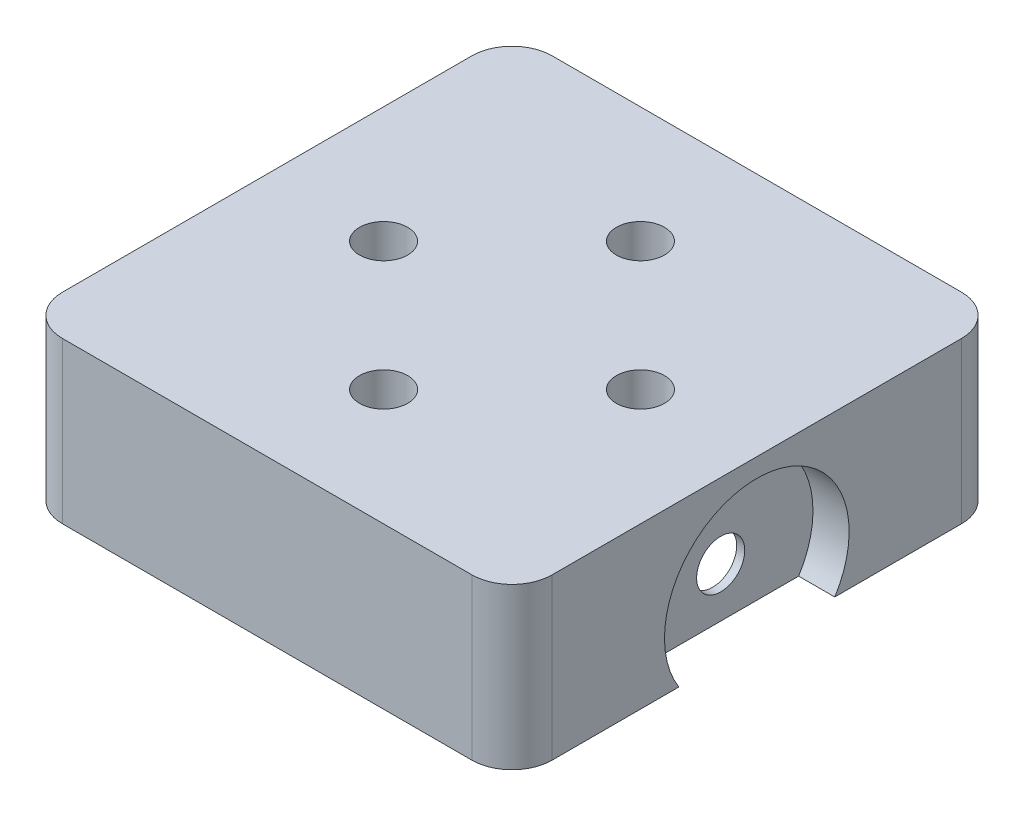
ISO-10303-21;
HEADER;
FILE_DESCRIPTION(('STEP AP214'),'2;1');
FILE_NAME('part.step','',(''),(''),'','','');
FILE_SCHEMA(('AUTOMOTIVE_DESIGN { 1 0 10303 214 1 1 1 1 }'));
ENDSEC;
DATA;
#1=APPLICATION_CONTEXT('core data for automotive mechanical design processes');
#2=APPLICATION_PROTOCOL_DEFINITION('international standard','automotive_design',2000,#1);
#3=PRODUCT_CONTEXT('',#1,'mechanical');
#4=PRODUCT('Part','Part','',(#3));
#5=PRODUCT_RELATED_PRODUCT_CATEGORY('part','',(#4));
#6=PRODUCT_DEFINITION_FORMATION('','',#4);
#7=PRODUCT_DEFINITION_CONTEXT('part definition',#1,'design');
#8=PRODUCT_DEFINITION('design','',#6,#7);
#9=PRODUCT_DEFINITION_SHAPE('','',#8);
#10=(LENGTH_UNIT() NAMED_UNIT(*) SI_UNIT(.MILLI.,.METRE.));
#11=(NAMED_UNIT(*) PLANE_ANGLE_UNIT() SI_UNIT($,.RADIAN.));
#12=(NAMED_UNIT(*) SI_UNIT($,.STERADIAN.) SOLID_ANGLE_UNIT());
#13=UNCERTAINTY_MEASURE_WITH_UNIT(LENGTH_MEASURE(1.E-05),#10,'distance_accuracy_value','');
#14=(GEOMETRIC_REPRESENTATION_CONTEXT(3) GLOBAL_UNCERTAINTY_ASSIGNED_CONTEXT((#13)) GLOBAL_UNIT_ASSIGNED_CONTEXT((#10,
#11,#12)) REPRESENTATION_CONTEXT('',''));
#15=CARTESIAN_POINT('',(0.,0.,0.));
#16=DIRECTION('',(0.,0.,1.));
#17=DIRECTION('',(1.,0.,0.));
#18=AXIS2_PLACEMENT_3D('',#15,#16,#17);
#19=CARTESIAN_POINT('',(220.,0.,-220.));
#20=DIRECTION('',(0.,-1.,0.));
#21=DIRECTION('',(0.,0.,-1.));
#22=AXIS2_PLACEMENT_3D('',#19,#20,#21);
#23=PLANE('',#22);
#24=DIRECTION('',(0.,0.,-1.));
#25=VECTOR('',#24,1.);
#26=CARTESIAN_POINT('',(250.,0.,-220.));
#27=LINE('',#26,#25);
#28=CARTESIAN_POINT('',(250.,0.,220.));
#29=VERTEX_POINT('',#28);
#30=CARTESIAN_POINT('',(250.,0.,-220.));
#31=VERTEX_POINT('',#30);
#32=EDGE_CURVE('E318',#29,#31,#27,.T.);
#33=ORIENTED_EDGE('',*,*,#32,.T.);
#34=CARTESIAN_POINT('',(220.,0.,-220.));
#35=DIRECTION('',(0.,-1.,0.));
#36=DIRECTION('',(0.,0.,-1.));
#37=AXIS2_PLACEMENT_3D('',#34,#35,#36);
#38=CIRCLE('',#37,30.);
#39=CARTESIAN_POINT('',(220.,0.,-250.));
#40=VERTEX_POINT('',#39);
#41=EDGE_CURVE('E391',#31,#40,#38,.F.);
#42=ORIENTED_EDGE('',*,*,#41,.T.);
#43=DIRECTION('',(-1.,0.,0.));
#44=VECTOR('',#43,1.);
#45=CARTESIAN_POINT('',(220.,0.,-250.));
#46=LINE('',#45,#44);
#47=CARTESIAN_POINT('',(-220.,0.,-250.));
#48=VERTEX_POINT('',#47);
#49=EDGE_CURVE('E395',#40,#48,#46,.T.);
#50=ORIENTED_EDGE('',*,*,#49,.T.);
#51=CARTESIAN_POINT('',(-220.,0.,-220.));
#52=DIRECTION('',(0.,-1.,0.));
#53=DIRECTION('',(0.,0.,-1.));
#54=AXIS2_PLACEMENT_3D('',#51,#52,#53);
#55=CIRCLE('',#54,30.);
#56=CARTESIAN_POINT('',(-250.,0.,-220.));
#57=VERTEX_POINT('',#56);
#58=EDGE_CURVE('E415',#48,#57,#55,.F.);
#59=ORIENTED_EDGE('',*,*,#58,.T.);
#60=DIRECTION('',(0.,0.,1.));
#61=VECTOR('',#60,1.);
#62=CARTESIAN_POINT('',(-250.,0.,-220.));
#63=LINE('',#62,#61);
#64=CARTESIAN_POINT('',(-250.,0.,220.));
#65=VERTEX_POINT('',#64);
#66=EDGE_CURVE('E411',#57,#65,#63,.T.);
#67=ORIENTED_EDGE('',*,*,#66,.T.);
#68=CARTESIAN_POINT('',(-220.,0.,220.));
#69=DIRECTION('',(0.,-1.,0.));
#70=DIRECTION('',(0.,0.,-1.));
#71=AXIS2_PLACEMENT_3D('',#68,#69,#70);
#72=CIRCLE('',#71,30.);
#73=CARTESIAN_POINT('',(-220.,0.,250.));
#74=VERTEX_POINT('',#73);
#75=EDGE_CURVE('E407',#65,#74,#72,.F.);
#76=ORIENTED_EDGE('',*,*,#75,.T.);
#77=DIRECTION('',(1.,0.,0.));
#78=VECTOR('',#77,1.);
#79=CARTESIAN_POINT('',(220.,0.,250.));
#80=LINE('',#79,#78);
#81=CARTESIAN_POINT('',(220.,0.,250.));
#82=VERTEX_POINT('',#81);
#83=EDGE_CURVE('E403',#74,#82,#80,.T.);
#84=ORIENTED_EDGE('',*,*,#83,.T.);
#85=CARTESIAN_POINT('',(220.,0.,220.));
#86=DIRECTION('',(0.,-1.,0.));
#87=DIRECTION('',(0.,0.,-1.));
#88=AXIS2_PLACEMENT_3D('',#85,#86,#87);
#89=CIRCLE('',#88,30.);
#90=EDGE_CURVE('E399',#82,#29,#89,.F.);
#91=ORIENTED_EDGE('',*,*,#90,.T.);
#92=EDGE_LOOP('',(#33,#42,#50,#59,#67,#76,#84,#91));
#93=FACE_BOUND('',#92,.T.);
#94=DIRECTION('',(0.,0.,1.));
#95=VECTOR('',#94,1.);
#96=CARTESIAN_POINT('',(-305.,0.,-255.));
#97=LINE('',#96,#95);
#98=CARTESIAN_POINT('',(-305.,0.,97.130306202736));
#99=VERTEX_POINT('',#98);
#100=CARTESIAN_POINT('',(-305.,0.,255.));
#101=VERTEX_POINT('',#100);
#102=EDGE_CURVE('E194',#99,#101,#97,.T.);
#103=ORIENTED_EDGE('',*,*,#102,.F.);
#104=DIRECTION('',(-1.,0.,0.));
#105=VECTOR('',#104,1.);
#106=CARTESIAN_POINT('',(-260.,0.,97.130306202736));
#107=LINE('',#106,#105);
#108=CARTESIAN_POINT('',(-260.,0.,97.130306202736));
#109=VERTEX_POINT('',#108);
#110=EDGE_CURVE('E55',#99,#109,#107,.F.);
#111=ORIENTED_EDGE('',*,*,#110,.T.);
#112=DIRECTION('',(0.,0.,-1.));
#113=VECTOR('',#112,1.);
#114=CARTESIAN_POINT('',(-260.,0.,-220.));
#115=LINE('',#114,#113);
#116=CARTESIAN_POINT('',(-260.,0.,-97.130306202736));
#117=VERTEX_POINT('',#116);
#118=EDGE_CURVE('E179',#109,#117,#115,.T.);
#119=ORIENTED_EDGE('',*,*,#118,.T.);
#120=DIRECTION('',(-1.,0.,0.));
#121=VECTOR('',#120,1.);
#122=CARTESIAN_POINT('',(-260.,0.,-97.130306202736));
#123=LINE('',#122,#121);
#124=CARTESIAN_POINT('',(-305.,0.,-97.130306202736));
#125=VERTEX_POINT('',#124);
#126=EDGE_CURVE('E186',#117,#125,#123,.T.);
#127=ORIENTED_EDGE('',*,*,#126,.T.);
#128=CARTESIAN_POINT('',(-305.,0.,-255.));
#129=VERTEX_POINT('',#128);
#130=EDGE_CURVE('E258',#129,#125,#97,.T.);
#131=ORIENTED_EDGE('',*,*,#130,.F.);
#132=CARTESIAN_POINT('',(-255.,0.,-255.));
#133=DIRECTION('',(0.,1.,0.));
#134=DIRECTION('',(0.,0.,-1.));
#135=AXIS2_PLACEMENT_3D('',#132,#133,#134);
#136=CIRCLE('',#135,50.);
#137=CARTESIAN_POINT('',(-255.,0.,-305.));
#138=VERTEX_POINT('',#137);
#139=EDGE_CURVE('E255',#138,#129,#136,.T.);
#140=ORIENTED_EDGE('',*,*,#139,.F.);
#141=DIRECTION('',(-1.,0.,0.));
#142=VECTOR('',#141,1.);
#143=CARTESIAN_POINT('',(-255.,0.,-305.));
#144=LINE('',#143,#142);
#145=CARTESIAN_POINT('',(255.,0.,-305.));
#146=VERTEX_POINT('',#145);
#147=EDGE_CURVE('E252',#146,#138,#144,.T.);
#148=ORIENTED_EDGE('',*,*,#147,.F.);
#149=CARTESIAN_POINT('',(255.,0.,-255.));
#150=DIRECTION('',(0.,1.,0.));
#151=DIRECTION('',(0.,0.,-1.));
#152=AXIS2_PLACEMENT_3D('',#149,#150,#151);
#153=CIRCLE('',#152,50.);
#154=CARTESIAN_POINT('',(305.,0.,-255.));
#155=VERTEX_POINT('',#154);
#156=EDGE_CURVE('E221',#155,#146,#153,.T.);
#157=ORIENTED_EDGE('',*,*,#156,.F.);
#158=DIRECTION('',(0.,0.,-1.));
#159=VECTOR('',#158,1.);
#160=CARTESIAN_POINT('',(305.,0.,-255.));
#161=LINE('',#160,#159);
#162=CARTESIAN_POINT('',(305.,0.,-97.130306202736));
#163=VERTEX_POINT('',#162);
#164=EDGE_CURVE('E271',#163,#155,#161,.T.);
#165=ORIENTED_EDGE('',*,*,#164,.F.);
#166=DIRECTION('',(1.,0.,0.));
#167=VECTOR('',#166,1.);
#168=CARTESIAN_POINT('',(260.,0.,-97.130306202736));
#169=LINE('',#168,#167);
#170=CARTESIAN_POINT('',(260.,0.,-97.130306202736));
#171=VERTEX_POINT('',#170);
#172=EDGE_CURVE('E63',#171,#163,#169,.T.);
#173=ORIENTED_EDGE('',*,*,#172,.F.);
#174=DIRECTION('',(0.,0.,1.));
#175=VECTOR('',#174,1.);
#176=CARTESIAN_POINT('',(260.,0.,-220.));
#177=LINE('',#176,#175);
#178=CARTESIAN_POINT('',(260.,0.,97.130306202736));
#179=VERTEX_POINT('',#178);
#180=EDGE_CURVE('E49',#171,#179,#177,.T.);
#181=ORIENTED_EDGE('',*,*,#180,.T.);
#182=DIRECTION('',(1.,0.,0.));
#183=VECTOR('',#182,1.);
#184=CARTESIAN_POINT('',(260.,0.,97.130306202736));
#185=LINE('',#184,#183);
#186=CARTESIAN_POINT('',(305.,0.,97.130306202736));
#187=VERTEX_POINT('',#186);
#188=EDGE_CURVE('E216',#187,#179,#185,.F.);
#189=ORIENTED_EDGE('',*,*,#188,.F.);
#190=CARTESIAN_POINT('',(305.,0.,255.));
#191=VERTEX_POINT('',#190);
#192=EDGE_CURVE('E227',#191,#187,#161,.T.);
#193=ORIENTED_EDGE('',*,*,#192,.F.);
#194=CARTESIAN_POINT('',(255.,0.,255.));
#195=DIRECTION('',(0.,1.,0.));
#196=DIRECTION('',(0.,0.,1.));
#197=AXIS2_PLACEMENT_3D('',#194,#195,#196);
#198=CIRCLE('',#197,50.);
#199=CARTESIAN_POINT('',(255.,0.,305.));
#200=VERTEX_POINT('',#199);
#201=EDGE_CURVE('E268',#200,#191,#198,.T.);
#202=ORIENTED_EDGE('',*,*,#201,.F.);
#203=DIRECTION('',(1.,0.,0.));
#204=VECTOR('',#203,1.);
#205=CARTESIAN_POINT('',(-255.,0.,305.));
#206=LINE('',#205,#204);
#207=CARTESIAN_POINT('',(-255.,0.,305.));
#208=VERTEX_POINT('',#207);
#209=EDGE_CURVE('E265',#208,#200,#206,.T.);
#210=ORIENTED_EDGE('',*,*,#209,.F.);
#211=CARTESIAN_POINT('',(-255.,0.,255.));
#212=DIRECTION('',(0.,1.,0.));
#213=DIRECTION('',(0.,0.,-1.));
#214=AXIS2_PLACEMENT_3D('',#211,#212,#213);
#215=CIRCLE('',#214,50.);
#216=EDGE_CURVE('E262',#101,#208,#215,.T.);
#217=ORIENTED_EDGE('',*,*,#216,.F.);
#218=EDGE_LOOP('',(#103,#111,#119,#127,#131,#140,#148,#157,#165,#173,#181,#189,#193,#202,#210,#217));
#219=FACE_BOUND('',#218,.T.);
#220=ADVANCED_FACE('F41',(#93,#219),#23,.T.);
#221=CARTESIAN_POINT('',(-305.,61.5686902326398,0.));
#222=DIRECTION('',(1.,0.,0.));
#223=DIRECTION('',(0.,0.,-1.));
#224=AXIS2_PLACEMENT_3D('',#221,#222,#223);
#225=CYLINDRICAL_SURFACE('',#224,30.);
#226=CARTESIAN_POINT('',(-250.,61.5686902326398,0.));
#227=DIRECTION('',(1.,0.,0.));
#228=DIRECTION('',(0.,0.,-1.));
#229=AXIS2_PLACEMENT_3D('',#226,#227,#228);
#230=CIRCLE('',#229,30.);
#231=CARTESIAN_POINT('',(-250.,61.5686902326398,-30.));
#232=VERTEX_POINT('',#231);
#233=EDGE_CURVE('E208',#232,#232,#230,.T.);
#234=ORIENTED_EDGE('',*,*,#233,.T.);
#235=EDGE_LOOP('',(#234));
#236=FACE_BOUND('',#235,.T.);
#237=CARTESIAN_POINT('',(-260.,61.5686902326398,0.));
#238=DIRECTION('',(-1.,0.,0.));
#239=DIRECTION('',(0.,0.,1.));
#240=AXIS2_PLACEMENT_3D('',#237,#238,#239);
#241=CIRCLE('',#240,30.);
#242=CARTESIAN_POINT('',(-260.,61.5686902326398,30.));
#243=VERTEX_POINT('',#242);
#244=EDGE_CURVE('E187',#243,#243,#241,.F.);
#245=ORIENTED_EDGE('',*,*,#244,.F.);
#246=EDGE_LOOP('',(#245));
#247=FACE_BOUND('',#246,.T.);
#248=ADVANCED_FACE('F462',(#236,#247),#225,.F.);
#249=CARTESIAN_POINT('',(220.,200.,-220.));
#250=DIRECTION('',(0.,-1.,0.));
#251=DIRECTION('',(0.,0.,-1.));
#252=AXIS2_PLACEMENT_3D('',#249,#250,#251);
#253=CYLINDRICAL_SURFACE('',#252,30.);
#254=ORIENTED_EDGE('',*,*,#41,.F.);
#255=DIRECTION('',(0.,-1.,0.));
#256=VECTOR('',#255,1.);
#257=CARTESIAN_POINT('',(250.,200.,-220.));
#258=LINE('',#257,#256);
#259=CARTESIAN_POINT('',(250.,180.,-220.));
#260=VERTEX_POINT('',#259);
#261=EDGE_CURVE('E319',#260,#31,#258,.T.);
#262=ORIENTED_EDGE('',*,*,#261,.F.);
#263=CARTESIAN_POINT('',(220.,180.,-220.));
#264=DIRECTION('',(0.,-1.,0.));
#265=DIRECTION('',(0.,0.,-1.));
#266=AXIS2_PLACEMENT_3D('',#263,#264,#265);
#267=CIRCLE('',#266,30.);
#268=CARTESIAN_POINT('',(220.,180.,-250.));
#269=VERTEX_POINT('',#268);
#270=EDGE_CURVE('E313',#260,#269,#267,.F.);
#271=ORIENTED_EDGE('',*,*,#270,.T.);
#272=DIRECTION('',(0.,1.,0.));
#273=VECTOR('',#272,1.);
#274=CARTESIAN_POINT('',(220.,200.,-250.));
#275=LINE('',#274,#273);
#276=EDGE_CURVE('E307',#269,#40,#275,.F.);
#277=ORIENTED_EDGE('',*,*,#276,.T.);
#278=EDGE_LOOP('',(#254,#262,#271,#277));
#279=FACE_BOUND('',#278,.T.);
#280=ADVANCED_FACE('F464',(#279),#253,.F.);
#281=CARTESIAN_POINT('',(-220.,200.,-250.));
#282=DIRECTION('',(0.,0.,1.));
#283=DIRECTION('',(1.,0.,0.));
#284=AXIS2_PLACEMENT_3D('',#281,#282,#283);
#285=PLANE('',#284);
#286=ORIENTED_EDGE('',*,*,#49,.F.);
#287=ORIENTED_EDGE('',*,*,#276,.F.);
#288=DIRECTION('',(-1.,0.,0.));
#289=VECTOR('',#288,1.);
#290=CARTESIAN_POINT('',(220.,180.,-250.));
#291=LINE('',#290,#289);
#292=CARTESIAN_POINT('',(-220.,180.,-250.));
#293=VERTEX_POINT('',#292);
#294=EDGE_CURVE('E317',#269,#293,#291,.T.);
#295=ORIENTED_EDGE('',*,*,#294,.T.);
#296=DIRECTION('',(0.,-1.,0.));
#297=VECTOR('',#296,1.);
#298=CARTESIAN_POINT('',(-220.,200.,-250.));
#299=LINE('',#298,#297);
#300=EDGE_CURVE('E312',#293,#48,#299,.T.);
#301=ORIENTED_EDGE('',*,*,#300,.T.);
#302=EDGE_LOOP('',(#286,#287,#295,#301));
#303=FACE_BOUND('',#302,.T.);
#304=ADVANCED_FACE('F472',(#303),#285,.T.);
#305=CARTESIAN_POINT('',(-220.,200.,-220.));
#306=DIRECTION('',(0.,-1.,0.));
#307=DIRECTION('',(0.,0.,-1.));
#308=AXIS2_PLACEMENT_3D('',#305,#306,#307);
#309=CYLINDRICAL_SURFACE('',#308,30.);
#310=ORIENTED_EDGE('',*,*,#58,.F.);
#311=ORIENTED_EDGE('',*,*,#300,.F.);
#312=CARTESIAN_POINT('',(-220.,180.,-220.));
#313=DIRECTION('',(0.,-1.,0.));
#314=DIRECTION('',(0.,0.,-1.));
#315=AXIS2_PLACEMENT_3D('',#312,#313,#314);
#316=CIRCLE('',#315,30.);
#317=CARTESIAN_POINT('',(-250.,180.,-220.));
#318=VERTEX_POINT('',#317);
#319=EDGE_CURVE('E330',#293,#318,#316,.F.);
#320=ORIENTED_EDGE('',*,*,#319,.T.);
#321=DIRECTION('',(0.,1.,0.));
#322=VECTOR('',#321,1.);
#323=CARTESIAN_POINT('',(-250.,200.,-220.));
#324=LINE('',#323,#322);
#325=EDGE_CURVE('E327',#318,#57,#324,.F.);
#326=ORIENTED_EDGE('',*,*,#325,.T.);
#327=EDGE_LOOP('',(#310,#311,#320,#326));
#328=FACE_BOUND('',#327,.T.);
#329=ADVANCED_FACE('F563',(#328),#309,.F.);
#330=CARTESIAN_POINT('',(-250.,200.,-220.));
#331=DIRECTION('',(1.,0.,0.));
#332=DIRECTION('',(0.,0.,-1.));
#333=AXIS2_PLACEMENT_3D('',#330,#331,#332);
#334=PLANE('',#333);
#335=ORIENTED_EDGE('',*,*,#233,.F.);
#336=EDGE_LOOP('',(#335));
#337=FACE_BOUND('',#336,.T.);
#338=ORIENTED_EDGE('',*,*,#66,.F.);
#339=ORIENTED_EDGE('',*,*,#325,.F.);
#340=DIRECTION('',(0.,0.,1.));
#341=VECTOR('',#340,1.);
#342=CARTESIAN_POINT('',(-250.,180.,-220.));
#343=LINE('',#342,#341);
#344=CARTESIAN_POINT('',(-250.,180.,220.));
#345=VERTEX_POINT('',#344);
#346=EDGE_CURVE('E336',#318,#345,#343,.T.);
#347=ORIENTED_EDGE('',*,*,#346,.T.);
#348=DIRECTION('',(0.,-1.,0.));
#349=VECTOR('',#348,1.);
#350=CARTESIAN_POINT('',(-250.,200.,220.));
#351=LINE('',#350,#349);
#352=EDGE_CURVE('E333',#345,#65,#351,.T.);
#353=ORIENTED_EDGE('',*,*,#352,.T.);
#354=EDGE_LOOP('',(#338,#339,#347,#353));
#355=FACE_BOUND('',#354,.T.);
#356=ADVANCED_FACE('F567',(#337,#355),#334,.T.);
#357=CARTESIAN_POINT('',(-220.,200.,220.));
#358=DIRECTION('',(0.,-1.,0.));
#359=DIRECTION('',(0.,0.,-1.));
#360=AXIS2_PLACEMENT_3D('',#357,#358,#359);
#361=CYLINDRICAL_SURFACE('',#360,30.);
#362=ORIENTED_EDGE('',*,*,#75,.F.);
#363=ORIENTED_EDGE('',*,*,#352,.F.);
#364=CARTESIAN_POINT('',(-220.,180.,220.));
#365=DIRECTION('',(0.,-1.,0.));
#366=DIRECTION('',(0.,0.,-1.));
#367=AXIS2_PLACEMENT_3D('',#364,#365,#366);
#368=CIRCLE('',#367,30.);
#369=CARTESIAN_POINT('',(-220.,180.,250.));
#370=VERTEX_POINT('',#369);
#371=EDGE_CURVE('E342',#345,#370,#368,.F.);
#372=ORIENTED_EDGE('',*,*,#371,.T.);
#373=DIRECTION('',(0.,1.,0.));
#374=VECTOR('',#373,1.);
#375=CARTESIAN_POINT('',(-220.,200.,250.));
#376=LINE('',#375,#374);
#377=EDGE_CURVE('E339',#370,#74,#376,.F.);
#378=ORIENTED_EDGE('',*,*,#377,.T.);
#379=EDGE_LOOP('',(#362,#363,#372,#378));
#380=FACE_BOUND('',#379,.T.);
#381=ADVANCED_FACE('F571',(#380),#361,.F.);
#382=CARTESIAN_POINT('',(-220.,200.,250.));
#383=DIRECTION('',(0.,0.,-1.));
#384=DIRECTION('',(-1.,0.,0.));
#385=AXIS2_PLACEMENT_3D('',#382,#383,#384);
#386=PLANE('',#385);
#387=ORIENTED_EDGE('',*,*,#83,.F.);
#388=ORIENTED_EDGE('',*,*,#377,.F.);
#389=DIRECTION('',(1.,0.,0.));
#390=VECTOR('',#389,1.);
#391=CARTESIAN_POINT('',(220.,180.,250.));
#392=LINE('',#391,#390);
#393=CARTESIAN_POINT('',(220.,180.,250.));
#394=VERTEX_POINT('',#393);
#395=EDGE_CURVE('E348',#370,#394,#392,.T.);
#396=ORIENTED_EDGE('',*,*,#395,.T.);
#397=DIRECTION('',(0.,-1.,0.));
#398=VECTOR('',#397,1.);
#399=CARTESIAN_POINT('',(220.,200.,250.));
#400=LINE('',#399,#398);
#401=EDGE_CURVE('E345',#394,#82,#400,.T.);
#402=ORIENTED_EDGE('',*,*,#401,.T.);
#403=EDGE_LOOP('',(#387,#388,#396,#402));
#404=FACE_BOUND('',#403,.T.);
#405=ADVANCED_FACE('F575',(#404),#386,.T.);
#406=CARTESIAN_POINT('',(220.,200.,220.));
#407=DIRECTION('',(0.,-1.,0.));
#408=DIRECTION('',(0.,0.,-1.));
#409=AXIS2_PLACEMENT_3D('',#406,#407,#408);
#410=CYLINDRICAL_SURFACE('',#409,30.);
#411=ORIENTED_EDGE('',*,*,#90,.F.);
#412=ORIENTED_EDGE('',*,*,#401,.F.);
#413=CARTESIAN_POINT('',(220.,180.,220.));
#414=DIRECTION('',(0.,-1.,0.));
#415=DIRECTION('',(0.,0.,-1.));
#416=AXIS2_PLACEMENT_3D('',#413,#414,#415);
#417=CIRCLE('',#416,30.);
#418=CARTESIAN_POINT('',(250.,180.,220.));
#419=VERTEX_POINT('',#418);
#420=EDGE_CURVE('E353',#394,#419,#417,.F.);
#421=ORIENTED_EDGE('',*,*,#420,.T.);
#422=DIRECTION('',(0.,1.,0.));
#423=VECTOR('',#422,1.);
#424=CARTESIAN_POINT('',(250.,200.,220.));
#425=LINE('',#424,#423);
#426=EDGE_CURVE('E322',#419,#29,#425,.F.);
#427=ORIENTED_EDGE('',*,*,#426,.T.);
#428=EDGE_LOOP('',(#411,#412,#421,#427));
#429=FACE_BOUND('',#428,.T.);
#430=ADVANCED_FACE('F579',(#429),#410,.F.);
#431=CARTESIAN_POINT('',(250.,200.,-220.));
#432=DIRECTION('',(-1.,0.,0.));
#433=DIRECTION('',(0.,0.,1.));
#434=AXIS2_PLACEMENT_3D('',#431,#432,#433);
#435=PLANE('',#434);
#436=CARTESIAN_POINT('',(250.,61.5686902326398,0.));
#437=DIRECTION('',(-1.,0.,0.));
#438=DIRECTION('',(0.,0.,1.));
#439=AXIS2_PLACEMENT_3D('',#436,#437,#438);
#440=CIRCLE('',#439,30.);
#441=CARTESIAN_POINT('',(250.,61.5686902326398,30.));
#442=VERTEX_POINT('',#441);
#443=EDGE_CURVE('E201',#442,#442,#440,.T.);
#444=ORIENTED_EDGE('',*,*,#443,.F.);
#445=EDGE_LOOP('',(#444));
#446=FACE_BOUND('',#445,.T.);
#447=ORIENTED_EDGE('',*,*,#32,.F.);
#448=ORIENTED_EDGE('',*,*,#426,.F.);
#449=DIRECTION('',(0.,0.,-1.));
#450=VECTOR('',#449,1.);
#451=CARTESIAN_POINT('',(250.,180.,-220.));
#452=LINE('',#451,#450);
#453=EDGE_CURVE('E323',#419,#260,#452,.T.);
#454=ORIENTED_EDGE('',*,*,#453,.T.);
#455=ORIENTED_EDGE('',*,*,#261,.T.);
#456=EDGE_LOOP('',(#447,#448,#454,#455));
#457=FACE_BOUND('',#456,.T.);
#458=ADVANCED_FACE('F583',(#446,#457),#435,.T.);
#459=CARTESIAN_POINT('',(220.,180.,-220.));
#460=DIRECTION('',(0.,-1.,0.));
#461=DIRECTION('',(0.,0.,-1.));
#462=AXIS2_PLACEMENT_3D('',#459,#460,#461);
#463=PLANE('',#462);
#464=CARTESIAN_POINT('',(0.,180.,-160.));
#465=DIRECTION('',(0.,-1.,0.));
#466=DIRECTION('',(0.,0.,-1.));
#467=AXIS2_PLACEMENT_3D('',#464,#465,#466);
#468=CIRCLE('',#467,50.);
#469=CARTESIAN_POINT('',(0.,180.,-210.));
#470=VERTEX_POINT('',#469);
#471=EDGE_CURVE('E360',#470,#470,#468,.F.);
#472=ORIENTED_EDGE('',*,*,#471,.T.);
#473=EDGE_LOOP('',(#472));
#474=FACE_BOUND('',#473,.T.);
#475=CARTESIAN_POINT('',(160.000000000003,180.,-2.79725621607198E-12));
#476=DIRECTION('',(0.,-1.,0.));
#477=DIRECTION('',(0.,0.,-1.));
#478=AXIS2_PLACEMENT_3D('',#475,#476,#477);
#479=CIRCLE('',#478,50.);
#480=CARTESIAN_POINT('',(160.000000000003,180.,-50.0000000000028));
#481=VERTEX_POINT('',#480);
#482=EDGE_CURVE('E366',#481,#481,#479,.F.);
#483=ORIENTED_EDGE('',*,*,#482,.T.);
#484=EDGE_LOOP('',(#483));
#485=FACE_BOUND('',#484,.T.);
#486=CARTESIAN_POINT('',(5.59451243214397E-12,180.,160.));
#487=DIRECTION('',(0.,-1.,0.));
#488=DIRECTION('',(0.,0.,-1.));
#489=AXIS2_PLACEMENT_3D('',#486,#487,#488);
#490=CIRCLE('',#489,50.);
#491=CARTESIAN_POINT('',(5.59451243214397E-12,180.,110.));
#492=VERTEX_POINT('',#491);
#493=EDGE_CURVE('E371',#492,#492,#490,.F.);
#494=ORIENTED_EDGE('',*,*,#493,.T.);
#495=EDGE_LOOP('',(#494));
#496=FACE_BOUND('',#495,.T.);
#497=CARTESIAN_POINT('',(-159.999999999997,180.,2.81685056485834E-12));
#498=DIRECTION('',(0.,-1.,0.));
#499=DIRECTION('',(0.,0.,-1.));
#500=AXIS2_PLACEMENT_3D('',#497,#498,#499);
#501=CIRCLE('',#500,50.);
#502=CARTESIAN_POINT('',(-159.999999999997,180.,-49.9999999999972));
#503=VERTEX_POINT('',#502);
#504=EDGE_CURVE('E306',#503,#503,#501,.F.);
#505=ORIENTED_EDGE('',*,*,#504,.T.);
#506=EDGE_LOOP('',(#505));
#507=FACE_BOUND('',#506,.T.);
#508=ORIENTED_EDGE('',*,*,#270,.F.);
#509=ORIENTED_EDGE('',*,*,#453,.F.);
#510=ORIENTED_EDGE('',*,*,#420,.F.);
#511=ORIENTED_EDGE('',*,*,#395,.F.);
#512=ORIENTED_EDGE('',*,*,#371,.F.);
#513=ORIENTED_EDGE('',*,*,#346,.F.);
#514=ORIENTED_EDGE('',*,*,#319,.F.);
#515=ORIENTED_EDGE('',*,*,#294,.F.);
#516=EDGE_LOOP('',(#508,#509,#510,#511,#512,#513,#514,#515));
#517=FACE_BOUND('',#516,.T.);
#518=ADVANCED_FACE('F587',(#474,#485,#496,#507,#517),#463,.T.);
#519=CARTESIAN_POINT('',(-159.999999999997,140.,2.81685056485834E-12));
#520=DIRECTION('',(0.,1.,0.));
#521=DIRECTION('',(0.,0.,1.));
#522=AXIS2_PLACEMENT_3D('',#519,#520,#521);
#523=CYLINDRICAL_SURFACE('',#522,50.);
#524=CARTESIAN_POINT('',(-159.999999999997,120.,2.81685056485834E-12));
#525=DIRECTION('',(0.,1.,0.));
#526=DIRECTION('',(0.,0.,1.));
#527=AXIS2_PLACEMENT_3D('',#524,#525,#526);
#528=CIRCLE('',#527,50.);
#529=CARTESIAN_POINT('',(-159.999999999997,120.,50.0000000000028));
#530=VERTEX_POINT('',#529);
#531=EDGE_CURVE('E375',#530,#530,#528,.T.);
#532=ORIENTED_EDGE('',*,*,#531,.T.);
#533=EDGE_LOOP('',(#532));
#534=FACE_BOUND('',#533,.T.);
#535=ORIENTED_EDGE('',*,*,#504,.F.);
#536=EDGE_LOOP('',(#535));
#537=FACE_BOUND('',#536,.T.);
#538=ADVANCED_FACE('F591',(#534,#537),#523,.T.);
#539=CARTESIAN_POINT('',(-159.999999999997,120.,2.81685056485834E-12));
#540=DIRECTION('',(0.,1.,0.));
#541=DIRECTION('',(0.,0.,1.));
#542=AXIS2_PLACEMENT_3D('',#539,#540,#541);
#543=PLANE('',#542);
#544=ORIENTED_EDGE('',*,*,#531,.F.);
#545=EDGE_LOOP('',(#544));
#546=FACE_BOUND('',#545,.T.);
#547=ADVANCED_FACE('F595',(#546),#543,.F.);
#548=CARTESIAN_POINT('',(5.59451243214397E-12,140.,160.));
#549=DIRECTION('',(0.,1.,0.));
#550=DIRECTION('',(0.,0.,1.));
#551=AXIS2_PLACEMENT_3D('',#548,#549,#550);
#552=CYLINDRICAL_SURFACE('',#551,50.);
#553=CARTESIAN_POINT('',(5.59451243214397E-12,120.,160.));
#554=DIRECTION('',(0.,1.,0.));
#555=DIRECTION('',(0.,0.,1.));
#556=AXIS2_PLACEMENT_3D('',#553,#554,#555);
#557=CIRCLE('',#556,50.);
#558=CARTESIAN_POINT('',(5.59451243214397E-12,120.,210.));
#559=VERTEX_POINT('',#558);
#560=EDGE_CURVE('E370',#559,#559,#557,.T.);
#561=ORIENTED_EDGE('',*,*,#560,.T.);
#562=EDGE_LOOP('',(#561));
#563=FACE_BOUND('',#562,.T.);
#564=ORIENTED_EDGE('',*,*,#493,.F.);
#565=EDGE_LOOP('',(#564));
#566=FACE_BOUND('',#565,.T.);
#567=ADVANCED_FACE('F599',(#563,#566),#552,.T.);
#568=CARTESIAN_POINT('',(5.59451243214397E-12,120.,160.));
#569=DIRECTION('',(0.,1.,0.));
#570=DIRECTION('',(0.,0.,1.));
#571=AXIS2_PLACEMENT_3D('',#568,#569,#570);
#572=PLANE('',#571);
#573=ORIENTED_EDGE('',*,*,#560,.F.);
#574=EDGE_LOOP('',(#573));
#575=FACE_BOUND('',#574,.T.);
#576=ADVANCED_FACE('F603',(#575),#572,.F.);
#577=CARTESIAN_POINT('',(160.000000000003,140.,-2.79725621607198E-12));
#578=DIRECTION('',(0.,1.,0.));
#579=DIRECTION('',(0.,0.,1.));
#580=AXIS2_PLACEMENT_3D('',#577,#578,#579);
#581=CYLINDRICAL_SURFACE('',#580,50.);
#582=CARTESIAN_POINT('',(160.000000000003,120.,-2.79725621607198E-12));
#583=DIRECTION('',(0.,1.,0.));
#584=DIRECTION('',(0.,0.,1.));
#585=AXIS2_PLACEMENT_3D('',#582,#583,#584);
#586=CIRCLE('',#585,50.);
#587=CARTESIAN_POINT('',(160.000000000003,120.,49.9999999999972));
#588=VERTEX_POINT('',#587);
#589=EDGE_CURVE('E365',#588,#588,#586,.T.);
#590=ORIENTED_EDGE('',*,*,#589,.T.);
#591=EDGE_LOOP('',(#590));
#592=FACE_BOUND('',#591,.T.);
#593=ORIENTED_EDGE('',*,*,#482,.F.);
#594=EDGE_LOOP('',(#593));
#595=FACE_BOUND('',#594,.T.);
#596=ADVANCED_FACE('F607',(#592,#595),#581,.T.);
#597=CARTESIAN_POINT('',(160.000000000003,120.,-2.79725621607198E-12));
#598=DIRECTION('',(0.,1.,0.));
#599=DIRECTION('',(0.,0.,1.));
#600=AXIS2_PLACEMENT_3D('',#597,#598,#599);
#601=PLANE('',#600);
#602=ORIENTED_EDGE('',*,*,#589,.F.);
#603=EDGE_LOOP('',(#602));
#604=FACE_BOUND('',#603,.T.);
#605=ADVANCED_FACE('F611',(#604),#601,.F.);
#606=CARTESIAN_POINT('',(0.,140.,-160.));
#607=DIRECTION('',(0.,1.,0.));
#608=DIRECTION('',(0.,0.,1.));
#609=AXIS2_PLACEMENT_3D('',#606,#607,#608);
#610=CYLINDRICAL_SURFACE('',#609,50.);
#611=CARTESIAN_POINT('',(0.,120.,-160.));
#612=DIRECTION('',(0.,1.,0.));
#613=DIRECTION('',(0.,0.,1.));
#614=AXIS2_PLACEMENT_3D('',#611,#612,#613);
#615=CIRCLE('',#614,50.);
#616=CARTESIAN_POINT('',(0.,120.,-110.));
#617=VERTEX_POINT('',#616);
#618=EDGE_CURVE('E364',#617,#617,#615,.T.);
#619=ORIENTED_EDGE('',*,*,#618,.T.);
#620=EDGE_LOOP('',(#619));
#621=FACE_BOUND('',#620,.T.);
#622=ORIENTED_EDGE('',*,*,#471,.F.);
#623=EDGE_LOOP('',(#622));
#624=FACE_BOUND('',#623,.T.);
#625=ADVANCED_FACE('F615',(#621,#624),#610,.T.);
#626=CARTESIAN_POINT('',(0.,120.,-160.));
#627=DIRECTION('',(0.,1.,0.));
#628=DIRECTION('',(0.,0.,1.));
#629=AXIS2_PLACEMENT_3D('',#626,#627,#628);
#630=PLANE('',#629);
#631=ORIENTED_EDGE('',*,*,#618,.F.);
#632=EDGE_LOOP('',(#631));
#633=FACE_BOUND('',#632,.T.);
#634=ADVANCED_FACE('F559',(#633),#630,.F.);
#635=CARTESIAN_POINT('',(255.,200.,-255.));
#636=DIRECTION('',(0.,-1.,0.));
#637=DIRECTION('',(0.,0.,-1.));
#638=AXIS2_PLACEMENT_3D('',#635,#636,#637);
#639=CYLINDRICAL_SURFACE('',#638,50.);
#640=ORIENTED_EDGE('',*,*,#156,.T.);
#641=DIRECTION('',(0.,-1.,0.));
#642=VECTOR('',#641,1.);
#643=CARTESIAN_POINT('',(255.,200.,-305.));
#644=LINE('',#643,#642);
#645=CARTESIAN_POINT('',(255.,200.,-305.));
#646=VERTEX_POINT('',#645);
#647=EDGE_CURVE('E302',#646,#146,#644,.T.);
#648=ORIENTED_EDGE('',*,*,#647,.F.);
#649=CARTESIAN_POINT('',(255.,200.,-255.));
#650=DIRECTION('',(0.,1.,0.));
#651=DIRECTION('',(0.,0.,-1.));
#652=AXIS2_PLACEMENT_3D('',#649,#650,#651);
#653=CIRCLE('',#652,50.);
#654=CARTESIAN_POINT('',(305.,200.,-255.));
#655=VERTEX_POINT('',#654);
#656=EDGE_CURVE('E222',#655,#646,#653,.T.);
#657=ORIENTED_EDGE('',*,*,#656,.F.);
#658=DIRECTION('',(0.,-1.,0.));
#659=VECTOR('',#658,1.);
#660=CARTESIAN_POINT('',(305.,200.,-255.));
#661=LINE('',#660,#659);
#662=EDGE_CURVE('E248',#655,#155,#661,.T.);
#663=ORIENTED_EDGE('',*,*,#662,.T.);
#664=EDGE_LOOP('',(#640,#648,#657,#663));
#665=FACE_BOUND('',#664,.T.);
#666=ADVANCED_FACE('F533',(#665),#639,.T.);
#667=CARTESIAN_POINT('',(-255.,200.,-305.));
#668=DIRECTION('',(0.,0.,1.));
#669=DIRECTION('',(1.,0.,0.));
#670=AXIS2_PLACEMENT_3D('',#667,#668,#669);
#671=PLANE('',#670);
#672=ORIENTED_EDGE('',*,*,#147,.T.);
#673=DIRECTION('',(0.,-1.,0.));
#674=VECTOR('',#673,1.);
#675=CARTESIAN_POINT('',(-255.,200.,-305.));
#676=LINE('',#675,#674);
#677=CARTESIAN_POINT('',(-255.,200.,-305.));
#678=VERTEX_POINT('',#677);
#679=EDGE_CURVE('E298',#678,#138,#676,.T.);
#680=ORIENTED_EDGE('',*,*,#679,.F.);
#681=DIRECTION('',(-1.,0.,0.));
#682=VECTOR('',#681,1.);
#683=CARTESIAN_POINT('',(-255.,200.,-305.));
#684=LINE('',#683,#682);
#685=EDGE_CURVE('E226',#646,#678,#684,.T.);
#686=ORIENTED_EDGE('',*,*,#685,.F.);
#687=ORIENTED_EDGE('',*,*,#647,.T.);
#688=EDGE_LOOP('',(#672,#680,#686,#687));
#689=FACE_BOUND('',#688,.T.);
#690=ADVANCED_FACE('F529',(#689),#671,.F.);
#691=CARTESIAN_POINT('',(-255.,200.,-255.));
#692=DIRECTION('',(0.,-1.,0.));
#693=DIRECTION('',(0.,0.,-1.));
#694=AXIS2_PLACEMENT_3D('',#691,#692,#693);
#695=CYLINDRICAL_SURFACE('',#694,50.);
#696=ORIENTED_EDGE('',*,*,#139,.T.);
#697=DIRECTION('',(0.,-1.,0.));
#698=VECTOR('',#697,1.);
#699=CARTESIAN_POINT('',(-305.,200.,-255.));
#700=LINE('',#699,#698);
#701=CARTESIAN_POINT('',(-305.,200.,-255.));
#702=VERTEX_POINT('',#701);
#703=EDGE_CURVE('E294',#702,#129,#700,.T.);
#704=ORIENTED_EDGE('',*,*,#703,.F.);
#705=CARTESIAN_POINT('',(-255.,200.,-255.));
#706=DIRECTION('',(0.,1.,0.));
#707=DIRECTION('',(0.,0.,-1.));
#708=AXIS2_PLACEMENT_3D('',#705,#706,#707);
#709=CIRCLE('',#708,50.);
#710=EDGE_CURVE('E230',#678,#702,#709,.T.);
#711=ORIENTED_EDGE('',*,*,#710,.F.);
#712=ORIENTED_EDGE('',*,*,#679,.T.);
#713=EDGE_LOOP('',(#696,#704,#711,#712));
#714=FACE_BOUND('',#713,.T.);
#715=ADVANCED_FACE('F526',(#714),#695,.T.);
#716=CARTESIAN_POINT('',(-305.,200.,-255.));
#717=DIRECTION('',(1.,0.,0.));
#718=DIRECTION('',(0.,0.,-1.));
#719=AXIS2_PLACEMENT_3D('',#716,#717,#718);
#720=PLANE('',#719);
#721=CARTESIAN_POINT('',(-305.,61.5686902326398,0.));
#722=DIRECTION('',(1.,0.,0.));
#723=DIRECTION('',(0.,0.,-1.));
#724=AXIS2_PLACEMENT_3D('',#721,#722,#723);
#725=CIRCLE('',#724,115.);
#726=EDGE_CURVE('E11',#99,#125,#725,.F.);
#727=ORIENTED_EDGE('',*,*,#726,.F.);
#728=ORIENTED_EDGE('',*,*,#102,.T.);
#729=DIRECTION('',(0.,-1.,0.));
#730=VECTOR('',#729,1.);
#731=CARTESIAN_POINT('',(-305.,200.,255.));
#732=LINE('',#731,#730);
#733=CARTESIAN_POINT('',(-305.,200.,255.));
#734=VERTEX_POINT('',#733);
#735=EDGE_CURVE('E290',#734,#101,#732,.T.);
#736=ORIENTED_EDGE('',*,*,#735,.F.);
#737=DIRECTION('',(0.,0.,1.));
#738=VECTOR('',#737,1.);
#739=CARTESIAN_POINT('',(-305.,200.,-255.));
#740=LINE('',#739,#738);
#741=EDGE_CURVE('E233',#702,#734,#740,.T.);
#742=ORIENTED_EDGE('',*,*,#741,.F.);
#743=ORIENTED_EDGE('',*,*,#703,.T.);
#744=ORIENTED_EDGE('',*,*,#130,.T.);
#745=EDGE_LOOP('',(#727,#728,#736,#742,#743,#744));
#746=FACE_BOUND('',#745,.T.);
#747=ADVANCED_FACE('F502',(#746),#720,.F.);
#748=CARTESIAN_POINT('',(-255.,200.,255.));
#749=DIRECTION('',(0.,-1.,0.));
#750=DIRECTION('',(0.,0.,-1.));
#751=AXIS2_PLACEMENT_3D('',#748,#749,#750);
#752=CYLINDRICAL_SURFACE('',#751,50.);
#753=ORIENTED_EDGE('',*,*,#216,.T.);
#754=DIRECTION('',(0.,-1.,0.));
#755=VECTOR('',#754,1.);
#756=CARTESIAN_POINT('',(-255.,200.,305.));
#757=LINE('',#756,#755);
#758=CARTESIAN_POINT('',(-255.,200.,305.));
#759=VERTEX_POINT('',#758);
#760=EDGE_CURVE('E286',#759,#208,#757,.T.);
#761=ORIENTED_EDGE('',*,*,#760,.F.);
#762=CARTESIAN_POINT('',(-255.,200.,255.));
#763=DIRECTION('',(0.,1.,0.));
#764=DIRECTION('',(0.,0.,-1.));
#765=AXIS2_PLACEMENT_3D('',#762,#763,#764);
#766=CIRCLE('',#765,50.);
#767=EDGE_CURVE('E236',#734,#759,#766,.T.);
#768=ORIENTED_EDGE('',*,*,#767,.F.);
#769=ORIENTED_EDGE('',*,*,#735,.T.);
#770=EDGE_LOOP('',(#753,#761,#768,#769));
#771=FACE_BOUND('',#770,.T.);
#772=ADVANCED_FACE('F506',(#771),#752,.T.);
#773=CARTESIAN_POINT('',(-255.,200.,305.));
#774=DIRECTION('',(0.,0.,-1.));
#775=DIRECTION('',(-1.,0.,0.));
#776=AXIS2_PLACEMENT_3D('',#773,#774,#775);
#777=PLANE('',#776);
#778=ORIENTED_EDGE('',*,*,#209,.T.);
#779=DIRECTION('',(0.,-1.,0.));
#780=VECTOR('',#779,1.);
#781=CARTESIAN_POINT('',(255.,200.,305.));
#782=LINE('',#781,#780);
#783=CARTESIAN_POINT('',(255.,200.,305.));
#784=VERTEX_POINT('',#783);
#785=EDGE_CURVE('E282',#784,#200,#782,.T.);
#786=ORIENTED_EDGE('',*,*,#785,.F.);
#787=DIRECTION('',(1.,0.,0.));
#788=VECTOR('',#787,1.);
#789=CARTESIAN_POINT('',(-255.,200.,305.));
#790=LINE('',#789,#788);
#791=EDGE_CURVE('E239',#759,#784,#790,.T.);
#792=ORIENTED_EDGE('',*,*,#791,.F.);
#793=ORIENTED_EDGE('',*,*,#760,.T.);
#794=EDGE_LOOP('',(#778,#786,#792,#793));
#795=FACE_BOUND('',#794,.T.);
#796=ADVANCED_FACE('F512',(#795),#777,.F.);
#797=CARTESIAN_POINT('',(255.,200.,255.));
#798=DIRECTION('',(0.,-1.,0.));
#799=DIRECTION('',(0.,0.,-1.));
#800=AXIS2_PLACEMENT_3D('',#797,#798,#799);
#801=CYLINDRICAL_SURFACE('',#800,50.);
#802=ORIENTED_EDGE('',*,*,#201,.T.);
#803=DIRECTION('',(0.,-1.,0.));
#804=VECTOR('',#803,1.);
#805=CARTESIAN_POINT('',(305.,200.,255.));
#806=LINE('',#805,#804);
#807=CARTESIAN_POINT('',(305.,200.,255.));
#808=VERTEX_POINT('',#807);
#809=EDGE_CURVE('E278',#808,#191,#806,.T.);
#810=ORIENTED_EDGE('',*,*,#809,.F.);
#811=CARTESIAN_POINT('',(255.,200.,255.));
#812=DIRECTION('',(0.,1.,0.));
#813=DIRECTION('',(0.,0.,1.));
#814=AXIS2_PLACEMENT_3D('',#811,#812,#813);
#815=CIRCLE('',#814,50.);
#816=EDGE_CURVE('E242',#784,#808,#815,.T.);
#817=ORIENTED_EDGE('',*,*,#816,.F.);
#818=ORIENTED_EDGE('',*,*,#785,.T.);
#819=EDGE_LOOP('',(#802,#810,#817,#818));
#820=FACE_BOUND('',#819,.T.);
#821=ADVANCED_FACE('F516',(#820),#801,.T.);
#822=CARTESIAN_POINT('',(305.,200.,-255.));
#823=DIRECTION('',(-1.,0.,0.));
#824=DIRECTION('',(0.,0.,1.));
#825=AXIS2_PLACEMENT_3D('',#822,#823,#824);
#826=PLANE('',#825);
#827=ORIENTED_EDGE('',*,*,#192,.T.);
#828=CARTESIAN_POINT('',(305.,61.5686902326398,0.));
#829=DIRECTION('',(-1.,0.,0.));
#830=DIRECTION('',(0.,0.,1.));
#831=AXIS2_PLACEMENT_3D('',#828,#829,#830);
#832=CIRCLE('',#831,115.);
#833=EDGE_CURVE('E426',#187,#163,#832,.T.);
#834=ORIENTED_EDGE('',*,*,#833,.T.);
#835=ORIENTED_EDGE('',*,*,#164,.T.);
#836=ORIENTED_EDGE('',*,*,#662,.F.);
#837=DIRECTION('',(0.,0.,-1.));
#838=VECTOR('',#837,1.);
#839=CARTESIAN_POINT('',(305.,200.,-255.));
#840=LINE('',#839,#838);
#841=EDGE_CURVE('E245',#808,#655,#840,.T.);
#842=ORIENTED_EDGE('',*,*,#841,.F.);
#843=ORIENTED_EDGE('',*,*,#809,.T.);
#844=EDGE_LOOP('',(#827,#834,#835,#836,#842,#843));
#845=FACE_BOUND('',#844,.T.);
#846=ADVANCED_FACE('F534',(#845),#826,.F.);
#847=CARTESIAN_POINT('',(-159.999999999997,140.,2.81685056485834E-12));
#848=DIRECTION('',(0.,1.,0.));
#849=DIRECTION('',(0.,0.,1.));
#850=AXIS2_PLACEMENT_3D('',#847,#848,#849);
#851=PLANE('',#850);
#852=CARTESIAN_POINT('',(-159.999999999997,140.,2.81685056485834E-12));
#853=DIRECTION('',(0.,1.,0.));
#854=DIRECTION('',(0.,0.,1.));
#855=AXIS2_PLACEMENT_3D('',#852,#853,#854);
#856=CIRCLE('',#855,30.);
#857=CARTESIAN_POINT('',(-159.999999999997,140.,30.0000000000028));
#858=VERTEX_POINT('',#857);
#859=EDGE_CURVE('E447',#858,#858,#856,.T.);
#860=ORIENTED_EDGE('',*,*,#859,.T.);
#861=EDGE_LOOP('',(#860));
#862=FACE_BOUND('',#861,.T.);
#863=ADVANCED_FACE('F545',(#862),#851,.T.);
#864=CARTESIAN_POINT('',(5.59451243214397E-12,140.,160.));
#865=DIRECTION('',(0.,1.,0.));
#866=DIRECTION('',(0.,0.,1.));
#867=AXIS2_PLACEMENT_3D('',#864,#865,#866);
#868=PLANE('',#867);
#869=CARTESIAN_POINT('',(5.59451243214397E-12,140.,160.));
#870=DIRECTION('',(0.,1.,0.));
#871=DIRECTION('',(0.,0.,1.));
#872=AXIS2_PLACEMENT_3D('',#869,#870,#871);
#873=CIRCLE('',#872,30.);
#874=CARTESIAN_POINT('',(5.59451243214397E-12,140.,190.));
#875=VERTEX_POINT('',#874);
#876=EDGE_CURVE('E439',#875,#875,#873,.T.);
#877=ORIENTED_EDGE('',*,*,#876,.T.);
#878=EDGE_LOOP('',(#877));
#879=FACE_BOUND('',#878,.T.);
#880=ADVANCED_FACE('F635',(#879),#868,.T.);
#881=CARTESIAN_POINT('',(160.000000000003,140.,-2.79725621607198E-12));
#882=DIRECTION('',(0.,1.,0.));
#883=DIRECTION('',(0.,0.,1.));
#884=AXIS2_PLACEMENT_3D('',#881,#882,#883);
#885=PLANE('',#884);
#886=CARTESIAN_POINT('',(160.000000000003,140.,-2.79725621607198E-12));
#887=DIRECTION('',(0.,1.,0.));
#888=DIRECTION('',(0.,0.,1.));
#889=AXIS2_PLACEMENT_3D('',#886,#887,#888);
#890=CIRCLE('',#889,30.);
#891=CARTESIAN_POINT('',(160.000000000003,140.,29.9999999999972));
#892=VERTEX_POINT('',#891);
#893=EDGE_CURVE('E431',#892,#892,#890,.T.);
#894=ORIENTED_EDGE('',*,*,#893,.T.);
#895=EDGE_LOOP('',(#894));
#896=FACE_BOUND('',#895,.T.);
#897=ADVANCED_FACE('F627',(#896),#885,.T.);
#898=CARTESIAN_POINT('',(0.,140.,-160.));
#899=DIRECTION('',(0.,1.,0.));
#900=DIRECTION('',(0.,0.,1.));
#901=AXIS2_PLACEMENT_3D('',#898,#899,#900);
#902=PLANE('',#901);
#903=CARTESIAN_POINT('',(0.,140.,-160.));
#904=DIRECTION('',(0.,1.,0.));
#905=DIRECTION('',(0.,0.,1.));
#906=AXIS2_PLACEMENT_3D('',#903,#904,#905);
#907=CIRCLE('',#906,30.);
#908=CARTESIAN_POINT('',(0.,140.,-130.));
#909=VERTEX_POINT('',#908);
#910=EDGE_CURVE('E422',#909,#909,#907,.T.);
#911=ORIENTED_EDGE('',*,*,#910,.T.);
#912=EDGE_LOOP('',(#911));
#913=FACE_BOUND('',#912,.T.);
#914=ADVANCED_FACE('F623',(#913),#902,.T.);
#915=CARTESIAN_POINT('',(-159.999999999997,140.,2.81685056485834E-12));
#916=DIRECTION('',(0.,1.,0.));
#917=DIRECTION('',(0.,0.,1.));
#918=AXIS2_PLACEMENT_3D('',#915,#916,#917);
#919=CYLINDRICAL_SURFACE('',#918,30.);
#920=ORIENTED_EDGE('',*,*,#859,.F.);
#921=EDGE_LOOP('',(#920));
#922=FACE_BOUND('',#921,.T.);
#923=CARTESIAN_POINT('',(-159.999999999997,200.,2.81685056485834E-12));
#924=DIRECTION('',(0.,1.,0.));
#925=DIRECTION('',(0.,0.,1.));
#926=AXIS2_PLACEMENT_3D('',#923,#924,#925);
#927=CIRCLE('',#926,30.);
#928=CARTESIAN_POINT('',(-159.999999999997,200.,30.0000000000028));
#929=VERTEX_POINT('',#928);
#930=EDGE_CURVE('E311',#929,#929,#927,.T.);
#931=ORIENTED_EDGE('',*,*,#930,.T.);
#932=EDGE_LOOP('',(#931));
#933=FACE_BOUND('',#932,.T.);
#934=ADVANCED_FACE('F626',(#922,#933),#919,.F.);
#935=CARTESIAN_POINT('',(5.59451243214397E-12,140.,160.));
#936=DIRECTION('',(0.,1.,0.));
#937=DIRECTION('',(0.,0.,1.));
#938=AXIS2_PLACEMENT_3D('',#935,#936,#937);
#939=CYLINDRICAL_SURFACE('',#938,30.);
#940=ORIENTED_EDGE('',*,*,#876,.F.);
#941=EDGE_LOOP('',(#940));
#942=FACE_BOUND('',#941,.T.);
#943=CARTESIAN_POINT('',(5.59451243214397E-12,200.,160.));
#944=DIRECTION('',(0.,1.,0.));
#945=DIRECTION('',(0.,0.,1.));
#946=AXIS2_PLACEMENT_3D('',#943,#944,#945);
#947=CIRCLE('',#946,30.);
#948=CARTESIAN_POINT('',(5.59451243214397E-12,200.,190.));
#949=VERTEX_POINT('',#948);
#950=EDGE_CURVE('E443',#949,#949,#947,.T.);
#951=ORIENTED_EDGE('',*,*,#950,.T.);
#952=EDGE_LOOP('',(#951));
#953=FACE_BOUND('',#952,.T.);
#954=ADVANCED_FACE('F639',(#942,#953),#939,.F.);
#955=CARTESIAN_POINT('',(160.000000000003,140.,-2.79725621607198E-12));
#956=DIRECTION('',(0.,1.,0.));
#957=DIRECTION('',(0.,0.,1.));
#958=AXIS2_PLACEMENT_3D('',#955,#956,#957);
#959=CYLINDRICAL_SURFACE('',#958,30.);
#960=ORIENTED_EDGE('',*,*,#893,.F.);
#961=EDGE_LOOP('',(#960));
#962=FACE_BOUND('',#961,.T.);
#963=CARTESIAN_POINT('',(160.000000000003,200.,-2.79725621607198E-12));
#964=DIRECTION('',(0.,1.,0.));
#965=DIRECTION('',(0.,0.,1.));
#966=AXIS2_PLACEMENT_3D('',#963,#964,#965);
#967=CIRCLE('',#966,30.);
#968=CARTESIAN_POINT('',(160.000000000003,200.,29.9999999999972));
#969=VERTEX_POINT('',#968);
#970=EDGE_CURVE('E435',#969,#969,#967,.T.);
#971=ORIENTED_EDGE('',*,*,#970,.T.);
#972=EDGE_LOOP('',(#971));
#973=FACE_BOUND('',#972,.T.);
#974=ADVANCED_FACE('F631',(#962,#973),#959,.F.);
#975=CARTESIAN_POINT('',(0.,140.,-160.));
#976=DIRECTION('',(0.,1.,0.));
#977=DIRECTION('',(0.,0.,1.));
#978=AXIS2_PLACEMENT_3D('',#975,#976,#977);
#979=CYLINDRICAL_SURFACE('',#978,30.);
#980=ORIENTED_EDGE('',*,*,#910,.F.);
#981=EDGE_LOOP('',(#980));
#982=FACE_BOUND('',#981,.T.);
#983=CARTESIAN_POINT('',(0.,200.,-160.));
#984=DIRECTION('',(0.,1.,0.));
#985=DIRECTION('',(0.,0.,1.));
#986=AXIS2_PLACEMENT_3D('',#983,#984,#985);
#987=CIRCLE('',#986,30.);
#988=CARTESIAN_POINT('',(0.,200.,-130.));
#989=VERTEX_POINT('',#988);
#990=EDGE_CURVE('E427',#989,#989,#987,.T.);
#991=ORIENTED_EDGE('',*,*,#990,.T.);
#992=EDGE_LOOP('',(#991));
#993=FACE_BOUND('',#992,.T.);
#994=ADVANCED_FACE('F540',(#982,#993),#979,.F.);
#995=CARTESIAN_POINT('',(220.,200.,-220.));
#996=DIRECTION('',(0.,-1.,0.));
#997=DIRECTION('',(0.,0.,-1.));
#998=AXIS2_PLACEMENT_3D('',#995,#996,#997);
#999=PLANE('',#998);
#1000=ORIENTED_EDGE('',*,*,#990,.F.);
#1001=EDGE_LOOP('',(#1000));
#1002=FACE_BOUND('',#1001,.T.);
#1003=ORIENTED_EDGE('',*,*,#970,.F.);
#1004=EDGE_LOOP('',(#1003));
#1005=FACE_BOUND('',#1004,.T.);
#1006=ORIENTED_EDGE('',*,*,#950,.F.);
#1007=EDGE_LOOP('',(#1006));
#1008=FACE_BOUND('',#1007,.T.);
#1009=ORIENTED_EDGE('',*,*,#930,.F.);
#1010=EDGE_LOOP('',(#1009));
#1011=FACE_BOUND('',#1010,.T.);
#1012=ORIENTED_EDGE('',*,*,#656,.T.);
#1013=ORIENTED_EDGE('',*,*,#685,.T.);
#1014=ORIENTED_EDGE('',*,*,#710,.T.);
#1015=ORIENTED_EDGE('',*,*,#741,.T.);
#1016=ORIENTED_EDGE('',*,*,#767,.T.);
#1017=ORIENTED_EDGE('',*,*,#791,.T.);
#1018=ORIENTED_EDGE('',*,*,#816,.T.);
#1019=ORIENTED_EDGE('',*,*,#841,.T.);
#1020=EDGE_LOOP('',(#1012,#1013,#1014,#1015,#1016,#1017,#1018,#1019));
#1021=FACE_BOUND('',#1020,.T.);
#1022=ADVANCED_FACE('F520',(#1002,#1005,#1008,#1011,#1021),#999,.F.);
#1023=CARTESIAN_POINT('',(260.,61.5686902326398,0.));
#1024=DIRECTION('',(1.,0.,0.));
#1025=DIRECTION('',(0.,0.,-1.));
#1026=AXIS2_PLACEMENT_3D('',#1023,#1024,#1025);
#1027=CYLINDRICAL_SURFACE('',#1026,115.);
#1028=ORIENTED_EDGE('',*,*,#172,.T.);
#1029=ORIENTED_EDGE('',*,*,#833,.F.);
#1030=ORIENTED_EDGE('',*,*,#188,.T.);
#1031=CARTESIAN_POINT('',(260.,61.5686902326398,0.));
#1032=DIRECTION('',(1.,0.,0.));
#1033=DIRECTION('',(0.,0.,-1.));
#1034=AXIS2_PLACEMENT_3D('',#1031,#1032,#1033);
#1035=CIRCLE('',#1034,115.);
#1036=EDGE_CURVE('E212',#171,#179,#1035,.T.);
#1037=ORIENTED_EDGE('',*,*,#1036,.F.);
#1038=EDGE_LOOP('',(#1028,#1029,#1030,#1037));
#1039=FACE_BOUND('',#1038,.T.);
#1040=ADVANCED_FACE('F486',(#1039),#1027,.F.);
#1041=CARTESIAN_POINT('',(260.,61.5686902326398,0.));
#1042=DIRECTION('',(1.,0.,0.));
#1043=DIRECTION('',(0.,0.,-1.));
#1044=AXIS2_PLACEMENT_3D('',#1041,#1042,#1043);
#1045=PLANE('',#1044);
#1046=CARTESIAN_POINT('',(260.,61.5686902326398,0.));
#1047=DIRECTION('',(1.,0.,0.));
#1048=DIRECTION('',(0.,0.,-1.));
#1049=AXIS2_PLACEMENT_3D('',#1046,#1047,#1048);
#1050=CIRCLE('',#1049,30.);
#1051=CARTESIAN_POINT('',(260.,61.5686902326398,-30.));
#1052=VERTEX_POINT('',#1051);
#1053=EDGE_CURVE('E196',#1052,#1052,#1050,.T.);
#1054=ORIENTED_EDGE('',*,*,#1053,.F.);
#1055=EDGE_LOOP('',(#1054));
#1056=FACE_BOUND('',#1055,.T.);
#1057=ORIENTED_EDGE('',*,*,#1036,.T.);
#1058=ORIENTED_EDGE('',*,*,#180,.F.);
#1059=EDGE_LOOP('',(#1057,#1058));
#1060=FACE_BOUND('',#1059,.T.);
#1061=ADVANCED_FACE('F479',(#1056,#1060),#1045,.T.);
#1062=ORIENTED_EDGE('',*,*,#443,.T.);
#1063=EDGE_LOOP('',(#1062));
#1064=FACE_BOUND('',#1063,.T.);
#1065=ORIENTED_EDGE('',*,*,#1053,.T.);
#1066=EDGE_LOOP('',(#1065));
#1067=FACE_BOUND('',#1066,.T.);
#1068=ADVANCED_FACE('F467',(#1064,#1067),#225,.F.);
#1069=CARTESIAN_POINT('',(-260.,61.5686902326398,0.));
#1070=DIRECTION('',(-1.,0.,0.));
#1071=DIRECTION('',(0.,0.,-1.));
#1072=AXIS2_PLACEMENT_3D('',#1069,#1070,#1071);
#1073=PLANE('',#1072);
#1074=CARTESIAN_POINT('',(-260.,61.5686902326398,0.));
#1075=DIRECTION('',(1.,0.,0.));
#1076=DIRECTION('',(0.,0.,-1.));
#1077=AXIS2_PLACEMENT_3D('',#1074,#1075,#1076);
#1078=CIRCLE('',#1077,115.);
#1079=EDGE_CURVE('E182',#117,#109,#1078,.T.);
#1080=ORIENTED_EDGE('',*,*,#1079,.F.);
#1081=ORIENTED_EDGE('',*,*,#118,.F.);
#1082=EDGE_LOOP('',(#1080,#1081));
#1083=FACE_BOUND('',#1082,.T.);
#1084=ORIENTED_EDGE('',*,*,#244,.T.);
#1085=EDGE_LOOP('',(#1084));
#1086=FACE_BOUND('',#1085,.T.);
#1087=ADVANCED_FACE('F180',(#1083,#1086),#1073,.T.);
#1088=CARTESIAN_POINT('',(-260.,61.5686902326398,0.));
#1089=DIRECTION('',(-1.,0.,0.));
#1090=DIRECTION('',(0.,0.,1.));
#1091=AXIS2_PLACEMENT_3D('',#1088,#1089,#1090);
#1092=CYLINDRICAL_SURFACE('',#1091,115.);
#1093=ORIENTED_EDGE('',*,*,#726,.T.);
#1094=ORIENTED_EDGE('',*,*,#126,.F.);
#1095=ORIENTED_EDGE('',*,*,#1079,.T.);
#1096=ORIENTED_EDGE('',*,*,#110,.F.);
#1097=EDGE_LOOP('',(#1093,#1094,#1095,#1096));
#1098=FACE_BOUND('',#1097,.T.);
#1099=ADVANCED_FACE('F189',(#1098),#1092,.F.);
#1100=CLOSED_SHELL('',(#220,#248,#280,#304,#329,#356,#381,#405,#430,#458,#518,#538,#547,#567,
#576,#596,#605,#625,#634,#666,#690,#715,#747,#772,#796,#821,#846,#863,#880,#897,#914,#934,#954,
#974,#994,#1022,#1040,#1061,#1068,#1087,#1099));
#1101=MANIFOLD_SOLID_BREP('B2',#1100);
#1102=ADVANCED_BREP_SHAPE_REPRESENTATION('',(#18,#1101),#14);
#1103=SHAPE_DEFINITION_REPRESENTATION(#9,#1102);
ENDSEC;
END-ISO-10303-21;
